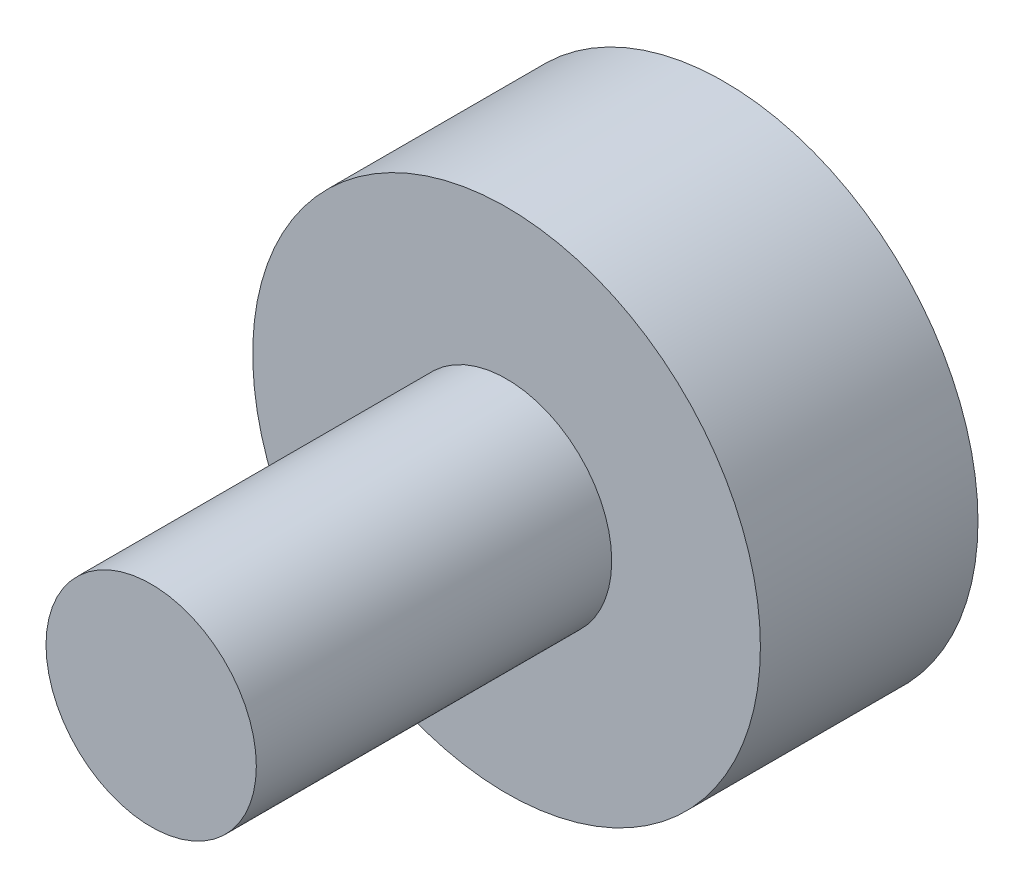
ISO-10303-21;
HEADER;
FILE_DESCRIPTION(('STEP AP214'),'2;1');
FILE_NAME('part.step','',(''),(''),'','','');
FILE_SCHEMA(('AUTOMOTIVE_DESIGN { 1 0 10303 214 1 1 1 1 }'));
ENDSEC;
DATA;
#1=APPLICATION_CONTEXT('core data for automotive mechanical design processes');
#2=APPLICATION_PROTOCOL_DEFINITION('international standard','automotive_design',2000,#1);
#3=PRODUCT_CONTEXT('',#1,'mechanical');
#4=PRODUCT('Part','Part','',(#3));
#5=PRODUCT_RELATED_PRODUCT_CATEGORY('part','',(#4));
#6=PRODUCT_DEFINITION_FORMATION('','',#4);
#7=PRODUCT_DEFINITION_CONTEXT('part definition',#1,'design');
#8=PRODUCT_DEFINITION('design','',#6,#7);
#9=PRODUCT_DEFINITION_SHAPE('','',#8);
#10=(LENGTH_UNIT() NAMED_UNIT(*) SI_UNIT(.MILLI.,.METRE.));
#11=(NAMED_UNIT(*) PLANE_ANGLE_UNIT() SI_UNIT($,.RADIAN.));
#12=(NAMED_UNIT(*) SI_UNIT($,.STERADIAN.) SOLID_ANGLE_UNIT());
#13=UNCERTAINTY_MEASURE_WITH_UNIT(LENGTH_MEASURE(1.E-05),#10,'distance_accuracy_value','');
#14=(GEOMETRIC_REPRESENTATION_CONTEXT(3) GLOBAL_UNCERTAINTY_ASSIGNED_CONTEXT((#13)) GLOBAL_UNIT_ASSIGNED_CONTEXT((#10,
#11,#12)) REPRESENTATION_CONTEXT('',''));
#15=CARTESIAN_POINT('',(0.,0.,0.));
#16=DIRECTION('',(0.,0.,1.));
#17=DIRECTION('',(1.,0.,0.));
#18=AXIS2_PLACEMENT_3D('',#15,#16,#17);
#19=CARTESIAN_POINT('',(0.,0.,3.));
#20=DIRECTION('',(0.,0.,-1.));
#21=DIRECTION('',(-1.,0.,0.));
#22=AXIS2_PLACEMENT_3D('',#19,#20,#21);
#23=CYLINDRICAL_SURFACE('',#22,3.5);
#24=CARTESIAN_POINT('',(0.,0.,3.));
#25=DIRECTION('',(0.,0.,1.));
#26=DIRECTION('',(1.,0.,0.));
#27=AXIS2_PLACEMENT_3D('',#24,#25,#26);
#28=CIRCLE('',#27,3.5);
#29=CARTESIAN_POINT('',(3.5,0.,3.));
#30=VERTEX_POINT('',#29);
#31=EDGE_CURVE('E38',#30,#30,#28,.T.);
#32=ORIENTED_EDGE('',*,*,#31,.F.);
#33=EDGE_LOOP('',(#32));
#34=FACE_BOUND('',#33,.T.);
#35=CARTESIAN_POINT('',(0.,0.,0.));
#36=DIRECTION('',(0.,0.,1.));
#37=DIRECTION('',(1.,0.,0.));
#38=AXIS2_PLACEMENT_3D('',#35,#36,#37);
#39=CIRCLE('',#38,3.5);
#40=CARTESIAN_POINT('',(3.5,0.,0.));
#41=VERTEX_POINT('',#40);
#42=EDGE_CURVE('E34',#41,#41,#39,.T.);
#43=ORIENTED_EDGE('',*,*,#42,.T.);
#44=EDGE_LOOP('',(#43));
#45=FACE_BOUND('',#44,.T.);
#46=ADVANCED_FACE('F31',(#34,#45),#23,.T.);
#47=CARTESIAN_POINT('',(0.,0.,3.));
#48=DIRECTION('',(0.,0.,1.));
#49=DIRECTION('',(1.,0.,0.));
#50=AXIS2_PLACEMENT_3D('',#47,#48,#49);
#51=PLANE('',#50);
#52=CARTESIAN_POINT('',(0.,0.,3.));
#53=DIRECTION('',(0.,0.,1.));
#54=DIRECTION('',(1.,0.,0.));
#55=AXIS2_PLACEMENT_3D('',#52,#53,#54);
#56=CIRCLE('',#55,1.45);
#57=CARTESIAN_POINT('',(1.45,0.,3.));
#58=VERTEX_POINT('',#57);
#59=EDGE_CURVE('E10',#58,#58,#56,.T.);
#60=ORIENTED_EDGE('',*,*,#59,.F.);
#61=EDGE_LOOP('',(#60));
#62=FACE_BOUND('',#61,.T.);
#63=ORIENTED_EDGE('',*,*,#31,.T.);
#64=EDGE_LOOP('',(#63));
#65=FACE_BOUND('',#64,.T.);
#66=ADVANCED_FACE('F55',(#62,#65),#51,.T.);
#67=CARTESIAN_POINT('',(0.,0.,0.));
#68=DIRECTION('',(0.,0.,1.));
#69=DIRECTION('',(1.,0.,0.));
#70=AXIS2_PLACEMENT_3D('',#67,#68,#69);
#71=PLANE('',#70);
#72=ORIENTED_EDGE('',*,*,#42,.F.);
#73=EDGE_LOOP('',(#72));
#74=FACE_BOUND('',#73,.T.);
#75=ADVANCED_FACE('F52',(#74),#71,.F.);
#76=CARTESIAN_POINT('',(0.,0.,7.9));
#77=DIRECTION('',(0.,0.,-1.));
#78=DIRECTION('',(-1.,0.,0.));
#79=AXIS2_PLACEMENT_3D('',#76,#77,#78);
#80=CYLINDRICAL_SURFACE('',#79,1.45);
#81=CARTESIAN_POINT('',(0.,0.,7.9));
#82=DIRECTION('',(0.,0.,1.));
#83=DIRECTION('',(1.,0.,0.));
#84=AXIS2_PLACEMENT_3D('',#81,#82,#83);
#85=CIRCLE('',#84,1.45);
#86=CARTESIAN_POINT('',(1.45,0.,7.9));
#87=VERTEX_POINT('',#86);
#88=EDGE_CURVE('E44',#87,#87,#85,.T.);
#89=ORIENTED_EDGE('',*,*,#88,.F.);
#90=EDGE_LOOP('',(#89));
#91=FACE_BOUND('',#90,.T.);
#92=ORIENTED_EDGE('',*,*,#59,.T.);
#93=EDGE_LOOP('',(#92));
#94=FACE_BOUND('',#93,.T.);
#95=ADVANCED_FACE('F54',(#91,#94),#80,.T.);
#96=CARTESIAN_POINT('',(0.,0.,7.9));
#97=DIRECTION('',(0.,0.,1.));
#98=DIRECTION('',(1.,0.,0.));
#99=AXIS2_PLACEMENT_3D('',#96,#97,#98);
#100=PLANE('',#99);
#101=ORIENTED_EDGE('',*,*,#88,.T.);
#102=EDGE_LOOP('',(#101));
#103=FACE_BOUND('',#102,.T.);
#104=ADVANCED_FACE('F60',(#103),#100,.T.);
#105=CLOSED_SHELL('',(#46,#66,#75,#95,#104));
#106=MANIFOLD_SOLID_BREP('B2',#105);
#107=ADVANCED_BREP_SHAPE_REPRESENTATION('',(#18,#106),#14);
#108=SHAPE_DEFINITION_REPRESENTATION(#9,#107);
ENDSEC;
END-ISO-10303-21;
